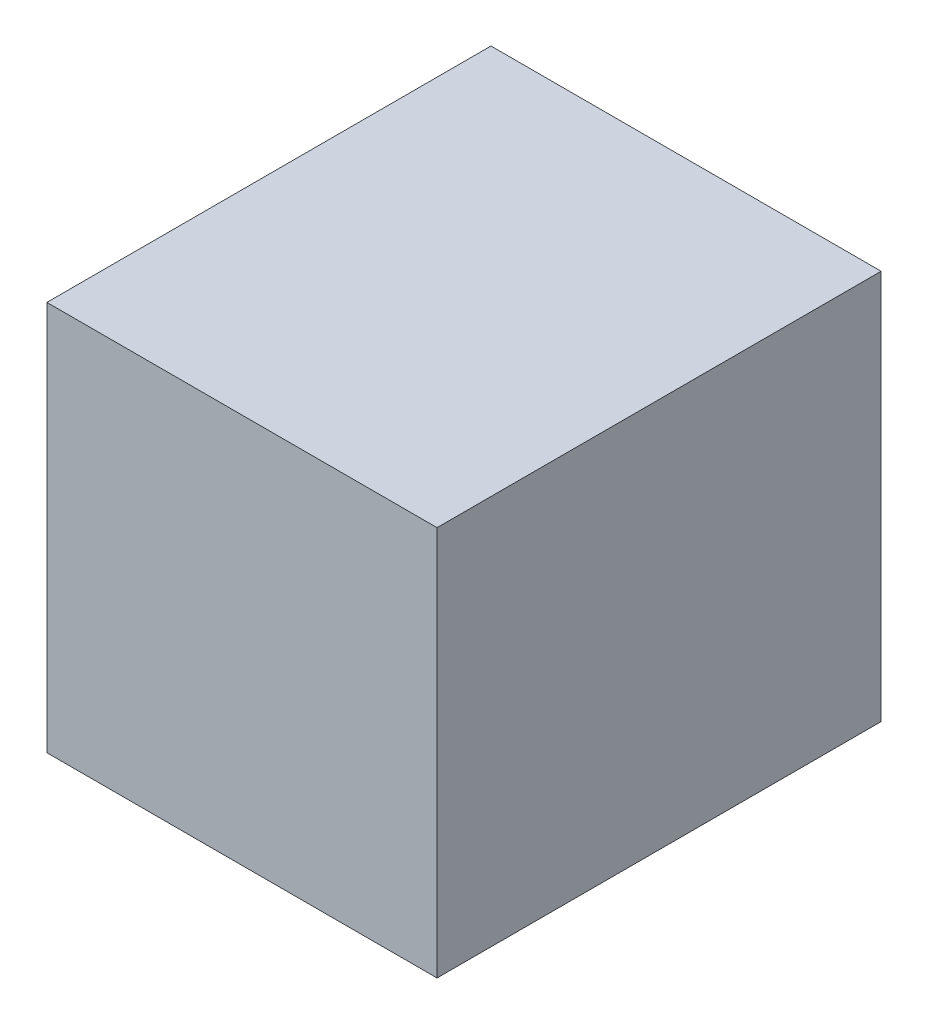
ISO-10303-21;
HEADER;
FILE_DESCRIPTION(('STEP AP214'),'2;1');
FILE_NAME('part.step','',(''),(''),'','','');
FILE_SCHEMA(('AUTOMOTIVE_DESIGN { 1 0 10303 214 1 1 1 1 }'));
ENDSEC;
DATA;
#1=APPLICATION_CONTEXT('core data for automotive mechanical design processes');
#2=APPLICATION_PROTOCOL_DEFINITION('international standard','automotive_design',2000,#1);
#3=PRODUCT_CONTEXT('',#1,'mechanical');
#4=PRODUCT('Part','Part','',(#3));
#5=PRODUCT_RELATED_PRODUCT_CATEGORY('part','',(#4));
#6=PRODUCT_DEFINITION_FORMATION('','',#4);
#7=PRODUCT_DEFINITION_CONTEXT('part definition',#1,'design');
#8=PRODUCT_DEFINITION('design','',#6,#7);
#9=PRODUCT_DEFINITION_SHAPE('','',#8);
#10=(LENGTH_UNIT() NAMED_UNIT(*) SI_UNIT(.MILLI.,.METRE.));
#11=(NAMED_UNIT(*) PLANE_ANGLE_UNIT() SI_UNIT($,.RADIAN.));
#12=(NAMED_UNIT(*) SI_UNIT($,.STERADIAN.) SOLID_ANGLE_UNIT());
#13=UNCERTAINTY_MEASURE_WITH_UNIT(LENGTH_MEASURE(1.E-05),#10,'distance_accuracy_value','');
#14=(GEOMETRIC_REPRESENTATION_CONTEXT(3) GLOBAL_UNCERTAINTY_ASSIGNED_CONTEXT((#13)) GLOBAL_UNIT_ASSIGNED_CONTEXT((#10,
#11,#12)) REPRESENTATION_CONTEXT('',''));
#15=CARTESIAN_POINT('',(0.,0.,0.));
#16=DIRECTION('',(0.,0.,1.));
#17=DIRECTION('',(1.,0.,0.));
#18=AXIS2_PLACEMENT_3D('',#15,#16,#17);
#19=CARTESIAN_POINT('',(0.,0.,21.0750000000001));
#20=DIRECTION('',(0.,0.,-1.));
#21=DIRECTION('',(0.,1.,0.));
#22=AXIS2_PLACEMENT_3D('',#19,#20,#21);
#23=PLANE('',#22);
#24=DIRECTION('',(0.,-1.,0.));
#25=VECTOR('',#24,1.);
#26=CARTESIAN_POINT('',(4.56000000000001,21.3125000000005,21.0750000000001));
#27=LINE('',#26,#25);
#28=CARTESIAN_POINT('',(4.56000000000001,37.1875000000005,21.0750000000001));
#29=VERTEX_POINT('',#28);
#30=CARTESIAN_POINT('',(4.56000000000001,21.3125000000005,21.0750000000001));
#31=VERTEX_POINT('',#30);
#32=EDGE_CURVE('E86',#29,#31,#27,.T.);
#33=ORIENTED_EDGE('',*,*,#32,.T.);
#34=DIRECTION('',(-1.,0.,0.));
#35=VECTOR('',#34,1.);
#36=CARTESIAN_POINT('',(26.3,21.3125000000005,21.0750000000001));
#37=LINE('',#36,#35);
#38=CARTESIAN_POINT('',(20.44,21.3125000000005,21.0750000000001));
#39=VERTEX_POINT('',#38);
#40=EDGE_CURVE('E12',#39,#31,#37,.T.);
#41=ORIENTED_EDGE('',*,*,#40,.F.);
#42=DIRECTION('',(0.,1.,0.));
#43=VECTOR('',#42,1.);
#44=CARTESIAN_POINT('',(20.44,37.1875000000005,21.0750000000001));
#45=LINE('',#44,#43);
#46=CARTESIAN_POINT('',(20.44,37.1875000000005,21.0750000000001));
#47=VERTEX_POINT('',#46);
#48=EDGE_CURVE('E55',#39,#47,#45,.T.);
#49=ORIENTED_EDGE('',*,*,#48,.T.);
#50=DIRECTION('',(1.,0.,0.));
#51=VECTOR('',#50,1.);
#52=CARTESIAN_POINT('',(-1.3,37.1875000000005,21.0750000000001));
#53=LINE('',#52,#51);
#54=EDGE_CURVE('E91',#29,#47,#53,.T.);
#55=ORIENTED_EDGE('',*,*,#54,.F.);
#56=EDGE_LOOP('',(#33,#41,#49,#55));
#57=FACE_BOUND('',#56,.T.);
#58=ADVANCED_FACE('F34',(#57),#23,.F.);
#59=CARTESIAN_POINT('',(-1.3,37.1875000000005,-28.8398433570268));
#60=DIRECTION('',(0.,-1.,0.));
#61=DIRECTION('',(0.,0.,-1.));
#62=AXIS2_PLACEMENT_3D('',#59,#60,#61);
#63=PLANE('',#62);
#64=DIRECTION('',(0.,0.,1.));
#65=VECTOR('',#64,1.);
#66=CARTESIAN_POINT('',(4.56000000000001,37.1875000000005,3.));
#67=LINE('',#66,#65);
#68=CARTESIAN_POINT('',(4.56000000000001,37.1875000000005,3.));
#69=VERTEX_POINT('',#68);
#70=EDGE_CURVE('E99',#69,#29,#67,.T.);
#71=ORIENTED_EDGE('',*,*,#70,.T.);
#72=ORIENTED_EDGE('',*,*,#54,.T.);
#73=DIRECTION('',(0.,0.,1.));
#74=VECTOR('',#73,1.);
#75=CARTESIAN_POINT('',(20.44,37.1875000000005,3.));
#76=LINE('',#75,#74);
#77=CARTESIAN_POINT('',(20.44,37.1875000000005,3.));
#78=VERTEX_POINT('',#77);
#79=EDGE_CURVE('E77',#78,#47,#76,.T.);
#80=ORIENTED_EDGE('',*,*,#79,.F.);
#81=DIRECTION('',(-1.,0.,0.));
#82=VECTOR('',#81,1.);
#83=CARTESIAN_POINT('',(-1.3,37.1875000000005,3.));
#84=LINE('',#83,#82);
#85=EDGE_CURVE('E85',#78,#69,#84,.T.);
#86=ORIENTED_EDGE('',*,*,#85,.T.);
#87=EDGE_LOOP('',(#71,#72,#80,#86));
#88=FACE_BOUND('',#87,.T.);
#89=ADVANCED_FACE('F107',(#88),#63,.F.);
#90=CARTESIAN_POINT('',(26.3,21.3125000000005,-28.8398433570268));
#91=DIRECTION('',(0.,1.,0.));
#92=DIRECTION('',(0.,0.,1.));
#93=AXIS2_PLACEMENT_3D('',#90,#91,#92);
#94=PLANE('',#93);
#95=DIRECTION('',(0.,0.,1.));
#96=VECTOR('',#95,1.);
#97=CARTESIAN_POINT('',(4.56000000000001,21.3125000000005,3.));
#98=LINE('',#97,#96);
#99=CARTESIAN_POINT('',(4.56000000000001,21.3125000000005,3.));
#100=VERTEX_POINT('',#99);
#101=EDGE_CURVE('E90',#100,#31,#98,.T.);
#102=ORIENTED_EDGE('',*,*,#101,.F.);
#103=DIRECTION('',(1.,0.,0.));
#104=VECTOR('',#103,1.);
#105=CARTESIAN_POINT('',(26.3,21.3125000000005,3.));
#106=LINE('',#105,#104);
#107=CARTESIAN_POINT('',(20.44,21.3125000000005,3.));
#108=VERTEX_POINT('',#107);
#109=EDGE_CURVE('E38',#100,#108,#106,.T.);
#110=ORIENTED_EDGE('',*,*,#109,.T.);
#111=DIRECTION('',(0.,0.,1.));
#112=VECTOR('',#111,1.);
#113=CARTESIAN_POINT('',(20.44,21.3125000000005,3.));
#114=LINE('',#113,#112);
#115=EDGE_CURVE('E72',#108,#39,#114,.T.);
#116=ORIENTED_EDGE('',*,*,#115,.T.);
#117=ORIENTED_EDGE('',*,*,#40,.T.);
#118=EDGE_LOOP('',(#102,#110,#116,#117));
#119=FACE_BOUND('',#118,.T.);
#120=ADVANCED_FACE('F89',(#119),#94,.F.);
#121=CARTESIAN_POINT('',(0.,0.,3.));
#122=DIRECTION('',(0.,0.,1.));
#123=DIRECTION('',(1.,0.,0.));
#124=AXIS2_PLACEMENT_3D('',#121,#122,#123);
#125=PLANE('',#124);
#126=DIRECTION('',(0.,-1.,0.));
#127=VECTOR('',#126,1.);
#128=CARTESIAN_POINT('',(4.56000000000001,21.3125000000005,3.));
#129=LINE('',#128,#127);
#130=EDGE_CURVE('E78',#69,#100,#129,.T.);
#131=ORIENTED_EDGE('',*,*,#130,.F.);
#132=ORIENTED_EDGE('',*,*,#85,.F.);
#133=DIRECTION('',(0.,1.,0.));
#134=VECTOR('',#133,1.);
#135=CARTESIAN_POINT('',(20.44,37.1875000000005,3.));
#136=LINE('',#135,#134);
#137=EDGE_CURVE('E50',#108,#78,#136,.T.);
#138=ORIENTED_EDGE('',*,*,#137,.F.);
#139=ORIENTED_EDGE('',*,*,#109,.F.);
#140=EDGE_LOOP('',(#131,#132,#138,#139));
#141=FACE_BOUND('',#140,.T.);
#142=ADVANCED_FACE('F36',(#141),#125,.F.);
#143=CARTESIAN_POINT('',(20.44,37.1875000000005,3.));
#144=DIRECTION('',(1.,0.,0.));
#145=DIRECTION('',(0.,0.,-1.));
#146=AXIS2_PLACEMENT_3D('',#143,#144,#145);
#147=PLANE('',#146);
#148=ORIENTED_EDGE('',*,*,#48,.F.);
#149=ORIENTED_EDGE('',*,*,#115,.F.);
#150=ORIENTED_EDGE('',*,*,#137,.T.);
#151=ORIENTED_EDGE('',*,*,#79,.T.);
#152=EDGE_LOOP('',(#148,#149,#150,#151));
#153=FACE_BOUND('',#152,.T.);
#154=ADVANCED_FACE('F73',(#153),#147,.T.);
#155=CARTESIAN_POINT('',(4.56000000000001,21.3125000000005,3.));
#156=DIRECTION('',(-1.,0.,0.));
#157=DIRECTION('',(0.,0.,1.));
#158=AXIS2_PLACEMENT_3D('',#155,#156,#157);
#159=PLANE('',#158);
#160=ORIENTED_EDGE('',*,*,#32,.F.);
#161=ORIENTED_EDGE('',*,*,#70,.F.);
#162=ORIENTED_EDGE('',*,*,#130,.T.);
#163=ORIENTED_EDGE('',*,*,#101,.T.);
#164=EDGE_LOOP('',(#160,#161,#162,#163));
#165=FACE_BOUND('',#164,.T.);
#166=ADVANCED_FACE('F106',(#165),#159,.T.);
#167=CLOSED_SHELL('',(#58,#89,#120,#142,#154,#166));
#168=MANIFOLD_SOLID_BREP('B2',#167);
#169=ADVANCED_BREP_SHAPE_REPRESENTATION('',(#18,#168),#14);
#170=SHAPE_DEFINITION_REPRESENTATION(#9,#169);
ENDSEC;
END-ISO-10303-21;
